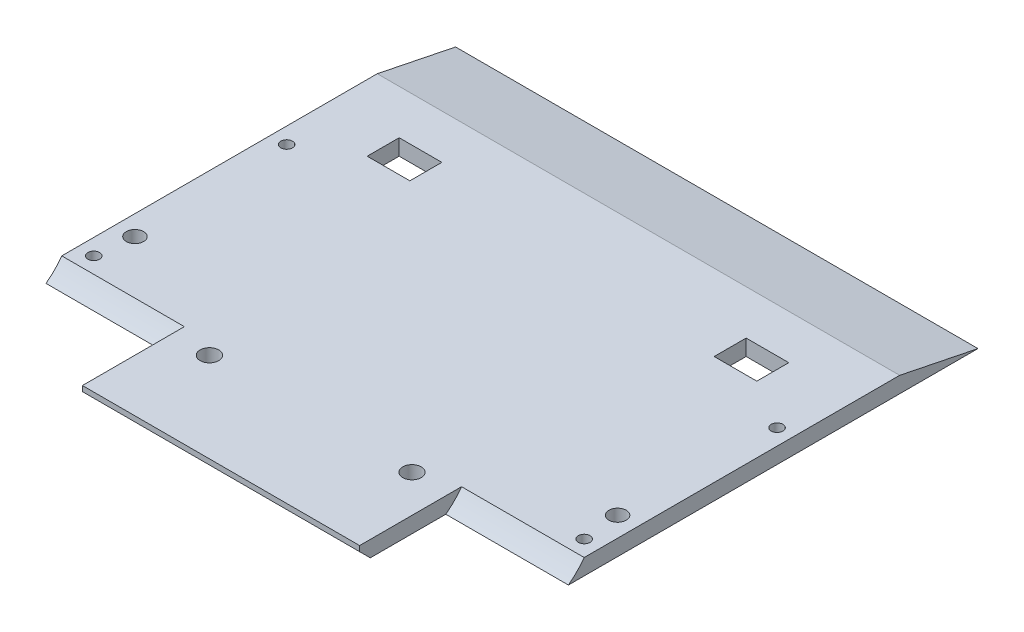
ISO-10303-21;
HEADER;
FILE_DESCRIPTION(('STEP AP214'),'2;1');
FILE_NAME('part.step','',(''),(''),'','','');
FILE_SCHEMA(('AUTOMOTIVE_DESIGN { 1 0 10303 214 1 1 1 1 }'));
ENDSEC;
DATA;
#1=APPLICATION_CONTEXT('core data for automotive mechanical design processes');
#2=APPLICATION_PROTOCOL_DEFINITION('international standard','automotive_design',2000,#1);
#3=PRODUCT_CONTEXT('',#1,'mechanical');
#4=PRODUCT('Part','Part','',(#3));
#5=PRODUCT_RELATED_PRODUCT_CATEGORY('part','',(#4));
#6=PRODUCT_DEFINITION_FORMATION('','',#4);
#7=PRODUCT_DEFINITION_CONTEXT('part definition',#1,'design');
#8=PRODUCT_DEFINITION('design','',#6,#7);
#9=PRODUCT_DEFINITION_SHAPE('','',#8);
#10=(LENGTH_UNIT() NAMED_UNIT(*) SI_UNIT(.MILLI.,.METRE.));
#11=(NAMED_UNIT(*) PLANE_ANGLE_UNIT() SI_UNIT($,.RADIAN.));
#12=(NAMED_UNIT(*) SI_UNIT($,.STERADIAN.) SOLID_ANGLE_UNIT());
#13=UNCERTAINTY_MEASURE_WITH_UNIT(LENGTH_MEASURE(1.E-05),#10,'distance_accuracy_value','');
#14=(GEOMETRIC_REPRESENTATION_CONTEXT(3) GLOBAL_UNCERTAINTY_ASSIGNED_CONTEXT((#13)) GLOBAL_UNIT_ASSIGNED_CONTEXT((#10,
#11,#12)) REPRESENTATION_CONTEXT('',''));
#15=CARTESIAN_POINT('',(0.,0.,0.));
#16=DIRECTION('',(0.,0.,1.));
#17=DIRECTION('',(1.,0.,0.));
#18=AXIS2_PLACEMENT_3D('',#15,#16,#17);
#19=CARTESIAN_POINT('',(28.1112716763006,3.,0.));
#20=DIRECTION('',(-1.,0.,0.));
#21=DIRECTION('',(0.,0.,1.));
#22=AXIS2_PLACEMENT_3D('',#19,#20,#21);
#23=PLANE('',#22);
#24=DIRECTION('',(0.,-1.,0.));
#25=VECTOR('',#24,1.);
#26=CARTESIAN_POINT('',(28.1112716763006,3.,54.9046242774567));
#27=LINE('',#26,#25);
#28=CARTESIAN_POINT('',(28.1112716763006,3.,54.9046242774567));
#29=VERTEX_POINT('',#28);
#30=CARTESIAN_POINT('',(28.1112716763006,2.00000000000003,54.9046242774567));
#31=VERTEX_POINT('',#30);
#32=EDGE_CURVE('E302',#29,#31,#27,.T.);
#33=ORIENTED_EDGE('',*,*,#32,.T.);
#34=DIRECTION('',(0.,-0.707106781186552,-0.707106781186543));
#35=VECTOR('',#34,1.);
#36=CARTESIAN_POINT('',(28.1112716763006,0.,52.9046242774566));
#37=LINE('',#36,#35);
#38=CARTESIAN_POINT('',(28.1112716763006,0.,52.9046242774566));
#39=VERTEX_POINT('',#38);
#40=EDGE_CURVE('E312',#31,#39,#37,.T.);
#41=ORIENTED_EDGE('',*,*,#40,.T.);
#42=DIRECTION('',(0.,0.,-1.));
#43=VECTOR('',#42,1.);
#44=CARTESIAN_POINT('',(28.1112716763006,0.,0.));
#45=LINE('',#44,#43);
#46=CARTESIAN_POINT('',(28.1112716763006,0.,38.7382297241669));
#47=VERTEX_POINT('',#46);
#48=EDGE_CURVE('E275',#39,#47,#45,.T.);
#49=ORIENTED_EDGE('',*,*,#48,.T.);
#50=CARTESIAN_POINT('',(28.1112716763006,11.,46.9046242774566));
#51=DIRECTION('',(-1.,0.,0.));
#52=DIRECTION('',(0.,0.,1.));
#53=AXIS2_PLACEMENT_3D('',#50,#51,#52);
#54=CIRCLE('',#53,13.7);
#55=CARTESIAN_POINT('',(28.1112716763006,3.,35.783023673227));
#56=VERTEX_POINT('',#55);
#57=EDGE_CURVE('E265',#56,#47,#54,.T.);
#58=ORIENTED_EDGE('',*,*,#57,.F.);
#59=DIRECTION('',(0.,0.,-1.));
#60=VECTOR('',#59,1.);
#61=CARTESIAN_POINT('',(28.1112716763006,3.,0.));
#62=LINE('',#61,#60);
#63=EDGE_CURVE('E279',#29,#56,#62,.T.);
#64=ORIENTED_EDGE('',*,*,#63,.F.);
#65=EDGE_LOOP('',(#33,#41,#49,#58,#64));
#66=FACE_BOUND('',#65,.T.);
#67=ADVANCED_FACE('F45',(#66),#23,.F.);
#68=CARTESIAN_POINT('',(-23.8887283236994,3.,0.));
#69=DIRECTION('',(-1.,0.,0.));
#70=DIRECTION('',(0.,0.,1.));
#71=AXIS2_PLACEMENT_3D('',#68,#69,#70);
#72=PLANE('',#71);
#73=DIRECTION('',(0.,0.,-1.));
#74=VECTOR('',#73,1.);
#75=CARTESIAN_POINT('',(-23.8887283236994,0.,0.));
#76=LINE('',#75,#74);
#77=CARTESIAN_POINT('',(-23.8887283236994,0.,52.9046242774567));
#78=VERTEX_POINT('',#77);
#79=CARTESIAN_POINT('',(-23.8887283236994,0.,38.7382297241669));
#80=VERTEX_POINT('',#79);
#81=EDGE_CURVE('E280',#78,#80,#76,.T.);
#82=ORIENTED_EDGE('',*,*,#81,.F.);
#83=DIRECTION('',(0.,0.707106781186552,0.707106781186543));
#84=VECTOR('',#83,1.);
#85=CARTESIAN_POINT('',(-23.8887283236994,-24.9523121387283,27.9523121387287));
#86=LINE('',#85,#84);
#87=CARTESIAN_POINT('',(-23.8887283236994,2.00000000000003,54.9046242774567));
#88=VERTEX_POINT('',#87);
#89=EDGE_CURVE('E308',#78,#88,#86,.T.);
#90=ORIENTED_EDGE('',*,*,#89,.T.);
#91=DIRECTION('',(0.,-1.,0.));
#92=VECTOR('',#91,1.);
#93=CARTESIAN_POINT('',(-23.8887283236994,3.,54.9046242774567));
#94=LINE('',#93,#92);
#95=CARTESIAN_POINT('',(-23.8887283236994,3.,54.9046242774567));
#96=VERTEX_POINT('',#95);
#97=EDGE_CURVE('E290',#96,#88,#94,.T.);
#98=ORIENTED_EDGE('',*,*,#97,.F.);
#99=DIRECTION('',(0.,0.,-1.));
#100=VECTOR('',#99,1.);
#101=CARTESIAN_POINT('',(-23.8887283236994,3.,0.));
#102=LINE('',#101,#100);
#103=CARTESIAN_POINT('',(-23.8887283236994,3.,35.7830236732271));
#104=VERTEX_POINT('',#103);
#105=EDGE_CURVE('E288',#96,#104,#102,.T.);
#106=ORIENTED_EDGE('',*,*,#105,.T.);
#107=CARTESIAN_POINT('',(-23.8887283236994,11.,46.9046242774566));
#108=DIRECTION('',(-1.,0.,0.));
#109=DIRECTION('',(0.,0.,1.));
#110=AXIS2_PLACEMENT_3D('',#107,#108,#109);
#111=CIRCLE('',#110,13.7);
#112=EDGE_CURVE('E262',#104,#80,#111,.T.);
#113=ORIENTED_EDGE('',*,*,#112,.T.);
#114=EDGE_LOOP('',(#82,#90,#98,#106,#113));
#115=FACE_BOUND('',#114,.T.);
#116=ADVANCED_FACE('F368',(#115),#72,.T.);
#117=CARTESIAN_POINT('',(0.,3.,54.9046242774567));
#118=DIRECTION('',(0.,0.,1.));
#119=DIRECTION('',(1.,0.,0.));
#120=AXIS2_PLACEMENT_3D('',#117,#118,#119);
#121=PLANE('',#120);
#122=ORIENTED_EDGE('',*,*,#97,.T.);
#123=DIRECTION('',(1.,0.,0.));
#124=VECTOR('',#123,1.);
#125=CARTESIAN_POINT('',(28.1112716763006,2.00000000000003,54.9046242774566));
#126=LINE('',#125,#124);
#127=EDGE_CURVE('E310',#88,#31,#126,.T.);
#128=ORIENTED_EDGE('',*,*,#127,.T.);
#129=ORIENTED_EDGE('',*,*,#32,.F.);
#130=DIRECTION('',(-1.,0.,0.));
#131=VECTOR('',#130,1.);
#132=CARTESIAN_POINT('',(0.,3.,54.9046242774567));
#133=LINE('',#132,#131);
#134=EDGE_CURVE('E276',#29,#96,#133,.T.);
#135=ORIENTED_EDGE('',*,*,#134,.T.);
#136=EDGE_LOOP('',(#122,#128,#129,#135));
#137=FACE_BOUND('',#136,.T.);
#138=ADVANCED_FACE('F374',(#137),#121,.T.);
#139=CARTESIAN_POINT('',(51.1112716763006,3.,0.));
#140=DIRECTION('',(1.,0.,0.));
#141=DIRECTION('',(0.,0.,-1.));
#142=AXIS2_PLACEMENT_3D('',#139,#140,#141);
#143=PLANE('',#142);
#144=DIRECTION('',(0.,0.,1.));
#145=VECTOR('',#144,1.);
#146=CARTESIAN_POINT('',(51.1112716763006,3.,0.));
#147=LINE('',#146,#145);
#148=CARTESIAN_POINT('',(51.1112716763006,3.,-23.3984372658443));
#149=VERTEX_POINT('',#148);
#150=CARTESIAN_POINT('',(51.1112716763006,3.,35.783023673227));
#151=VERTEX_POINT('',#150);
#152=EDGE_CURVE('E282',#149,#151,#147,.T.);
#153=ORIENTED_EDGE('',*,*,#152,.T.);
#154=CARTESIAN_POINT('',(51.1112716763006,11.,46.9046242774566));
#155=DIRECTION('',(-1.,0.,0.));
#156=DIRECTION('',(0.,0.,1.));
#157=AXIS2_PLACEMENT_3D('',#154,#155,#156);
#158=CIRCLE('',#157,13.7);
#159=CARTESIAN_POINT('',(51.1112716763006,0.,38.7382297241669));
#160=VERTEX_POINT('',#159);
#161=EDGE_CURVE('E253',#151,#160,#158,.T.);
#162=ORIENTED_EDGE('',*,*,#161,.T.);
#163=DIRECTION('',(0.,0.,1.));
#164=VECTOR('',#163,1.);
#165=CARTESIAN_POINT('',(51.1112716763006,0.,0.));
#166=LINE('',#165,#164);
#167=CARTESIAN_POINT('',(51.1112716763006,0.,-38.0953757225434));
#168=VERTEX_POINT('',#167);
#169=EDGE_CURVE('E292',#168,#160,#166,.T.);
#170=ORIENTED_EDGE('',*,*,#169,.F.);
#171=DIRECTION('',(0.,-0.2,-0.979795897113271));
#172=VECTOR('',#171,1.);
#173=CARTESIAN_POINT('',(51.1112716763006,7.5851385663873,-0.935937490633778));
#174=LINE('',#173,#172);
#175=EDGE_CURVE('E273',#149,#168,#174,.T.);
#176=ORIENTED_EDGE('',*,*,#175,.F.);
#177=EDGE_LOOP('',(#153,#162,#170,#176));
#178=FACE_BOUND('',#177,.T.);
#179=ADVANCED_FACE('F378',(#178),#143,.T.);
#180=CARTESIAN_POINT('',(-46.8887283236994,3.,0.));
#181=DIRECTION('',(1.,0.,0.));
#182=DIRECTION('',(0.,0.,-1.));
#183=AXIS2_PLACEMENT_3D('',#180,#181,#182);
#184=PLANE('',#183);
#185=CARTESIAN_POINT('',(-46.8887283236994,11.,46.9046242774566));
#186=DIRECTION('',(-1.,0.,0.));
#187=DIRECTION('',(0.,0.,1.));
#188=AXIS2_PLACEMENT_3D('',#185,#186,#187);
#189=CIRCLE('',#188,13.7);
#190=CARTESIAN_POINT('',(-46.8887283236994,3.,35.7830236732271));
#191=VERTEX_POINT('',#190);
#192=CARTESIAN_POINT('',(-46.8887283236994,0.,38.7382297241669));
#193=VERTEX_POINT('',#192);
#194=EDGE_CURVE('E252',#191,#193,#189,.T.);
#195=ORIENTED_EDGE('',*,*,#194,.F.);
#196=DIRECTION('',(0.,0.,1.));
#197=VECTOR('',#196,1.);
#198=CARTESIAN_POINT('',(-46.8887283236994,3.,0.));
#199=LINE('',#198,#197);
#200=CARTESIAN_POINT('',(-46.8887283236994,3.,-23.3984372658443));
#201=VERTEX_POINT('',#200);
#202=EDGE_CURVE('E285',#201,#191,#199,.T.);
#203=ORIENTED_EDGE('',*,*,#202,.F.);
#204=DIRECTION('',(0.,0.2,0.979795897113271));
#205=VECTOR('',#204,1.);
#206=CARTESIAN_POINT('',(-46.8887283236994,7.4651385663873,-1.52381502890173));
#207=LINE('',#206,#205);
#208=CARTESIAN_POINT('',(-46.8887283236994,0.,-38.0953757225434));
#209=VERTEX_POINT('',#208);
#210=EDGE_CURVE('E268',#209,#201,#207,.T.);
#211=ORIENTED_EDGE('',*,*,#210,.F.);
#212=DIRECTION('',(0.,0.,1.));
#213=VECTOR('',#212,1.);
#214=CARTESIAN_POINT('',(-46.8887283236994,0.,0.));
#215=LINE('',#214,#213);
#216=EDGE_CURVE('E297',#209,#193,#215,.T.);
#217=ORIENTED_EDGE('',*,*,#216,.T.);
#218=EDGE_LOOP('',(#195,#203,#211,#217));
#219=FACE_BOUND('',#218,.T.);
#220=ADVANCED_FACE('F385',(#219),#184,.F.);
#221=CARTESIAN_POINT('',(0.,3.,0.));
#222=DIRECTION('',(0.,1.,0.));
#223=DIRECTION('',(0.,0.,1.));
#224=AXIS2_PLACEMENT_3D('',#221,#222,#223);
#225=PLANE('',#224);
#226=DIRECTION('',(0.,0.,1.));
#227=VECTOR('',#226,1.);
#228=CARTESIAN_POINT('',(-34.4322346511358,3.,-15.0573010504283));
#229=LINE('',#228,#227);
#230=CARTESIAN_POINT('',(-34.4322346511358,3.,-15.0573010504283));
#231=VERTEX_POINT('',#230);
#232=CARTESIAN_POINT('',(-34.4322346511358,3.,-9.05730105042829));
#233=VERTEX_POINT('',#232);
#234=EDGE_CURVE('E61',#231,#233,#229,.T.);
#235=ORIENTED_EDGE('',*,*,#234,.F.);
#236=DIRECTION('',(-1.,0.,0.));
#237=VECTOR('',#236,1.);
#238=CARTESIAN_POINT('',(-34.4322346511358,3.,-15.0573010504283));
#239=LINE('',#238,#237);
#240=CARTESIAN_POINT('',(-26.4322346511358,3.,-15.0573010504283));
#241=VERTEX_POINT('',#240);
#242=EDGE_CURVE('E189',#241,#231,#239,.T.);
#243=ORIENTED_EDGE('',*,*,#242,.F.);
#244=DIRECTION('',(0.,0.,-1.));
#245=VECTOR('',#244,1.);
#246=CARTESIAN_POINT('',(-26.4322346511358,3.,-15.0573010504283));
#247=LINE('',#246,#245);
#248=CARTESIAN_POINT('',(-26.4322346511358,3.,-9.05730105042829));
#249=VERTEX_POINT('',#248);
#250=EDGE_CURVE('E172',#249,#241,#247,.T.);
#251=ORIENTED_EDGE('',*,*,#250,.F.);
#252=DIRECTION('',(1.,0.,0.));
#253=VECTOR('',#252,1.);
#254=CARTESIAN_POINT('',(-34.4322346511358,3.,-9.05730105042829));
#255=LINE('',#254,#253);
#256=EDGE_CURVE('E182',#233,#249,#255,.T.);
#257=ORIENTED_EDGE('',*,*,#256,.F.);
#258=EDGE_LOOP('',(#235,#243,#251,#257));
#259=FACE_BOUND('',#258,.T.);
#260=DIRECTION('',(0.,0.,1.));
#261=VECTOR('',#260,1.);
#262=CARTESIAN_POINT('',(30.6547780037371,3.,-15.0573010504283));
#263=LINE('',#262,#261);
#264=CARTESIAN_POINT('',(30.6547780037371,3.,-15.0573010504283));
#265=VERTEX_POINT('',#264);
#266=CARTESIAN_POINT('',(30.6547780037371,3.,-9.0573010504283));
#267=VERTEX_POINT('',#266);
#268=EDGE_CURVE('E69',#265,#267,#263,.T.);
#269=ORIENTED_EDGE('',*,*,#268,.F.);
#270=DIRECTION('',(-1.,0.,0.));
#271=VECTOR('',#270,1.);
#272=CARTESIAN_POINT('',(30.6547780037371,3.,-15.0573010504283));
#273=LINE('',#272,#271);
#274=CARTESIAN_POINT('',(38.6547780037371,3.,-15.0573010504283));
#275=VERTEX_POINT('',#274);
#276=EDGE_CURVE('E201',#275,#265,#273,.T.);
#277=ORIENTED_EDGE('',*,*,#276,.F.);
#278=DIRECTION('',(0.,0.,-1.));
#279=VECTOR('',#278,1.);
#280=CARTESIAN_POINT('',(38.6547780037371,3.,-15.0573010504283));
#281=LINE('',#280,#279);
#282=CARTESIAN_POINT('',(38.6547780037371,3.,-9.0573010504283));
#283=VERTEX_POINT('',#282);
#284=EDGE_CURVE('E210',#283,#275,#281,.T.);
#285=ORIENTED_EDGE('',*,*,#284,.F.);
#286=DIRECTION('',(1.,0.,0.));
#287=VECTOR('',#286,1.);
#288=CARTESIAN_POINT('',(30.6547780037371,3.,-9.0573010504283));
#289=LINE('',#288,#287);
#290=EDGE_CURVE('E213',#267,#283,#289,.T.);
#291=ORIENTED_EDGE('',*,*,#290,.F.);
#292=EDGE_LOOP('',(#269,#277,#285,#291));
#293=FACE_BOUND('',#292,.T.);
#294=CARTESIAN_POINT('',(-43.1587283236994,3.,25.7815627341557));
#295=DIRECTION('',(0.,1.,0.));
#296=DIRECTION('',(0.,0.,1.));
#297=AXIS2_PLACEMENT_3D('',#294,#295,#296);
#298=CIRCLE('',#297,1.6244518759601);
#299=CARTESIAN_POINT('',(-43.1587283236994,3.,27.4060146101158));
#300=VERTEX_POINT('',#299);
#301=EDGE_CURVE('E196',#300,#300,#298,.T.);
#302=ORIENTED_EDGE('',*,*,#301,.F.);
#303=EDGE_LOOP('',(#302));
#304=FACE_BOUND('',#303,.T.);
#305=CARTESIAN_POINT('',(47.3812716763006,3.,25.7815627341557));
#306=DIRECTION('',(0.,1.,0.));
#307=DIRECTION('',(0.,0.,1.));
#308=AXIS2_PLACEMENT_3D('',#305,#306,#307);
#309=CIRCLE('',#308,1.6244518759601);
#310=CARTESIAN_POINT('',(47.3812716763006,3.,27.4060146101158));
#311=VERTEX_POINT('',#310);
#312=EDGE_CURVE('E220',#311,#311,#309,.T.);
#313=ORIENTED_EDGE('',*,*,#312,.F.);
#314=EDGE_LOOP('',(#313));
#315=FACE_BOUND('',#314,.T.);
#316=CARTESIAN_POINT('',(-16.8887283236994,3.,38.0815627341557));
#317=DIRECTION('',(0.,1.,0.));
#318=DIRECTION('',(0.,0.,1.));
#319=AXIS2_PLACEMENT_3D('',#316,#317,#318);
#320=CIRCLE('',#319,1.75);
#321=CARTESIAN_POINT('',(-16.8887283236994,3.,39.8315627341557));
#322=VERTEX_POINT('',#321);
#323=EDGE_CURVE('E224',#322,#322,#320,.T.);
#324=ORIENTED_EDGE('',*,*,#323,.F.);
#325=EDGE_LOOP('',(#324));
#326=FACE_BOUND('',#325,.T.);
#327=CARTESIAN_POINT('',(21.1112716763006,3.,38.0815627341557));
#328=DIRECTION('',(0.,1.,0.));
#329=DIRECTION('',(0.,0.,1.));
#330=AXIS2_PLACEMENT_3D('',#327,#328,#329);
#331=CIRCLE('',#330,1.75);
#332=CARTESIAN_POINT('',(21.1112716763006,3.,39.8315627341557));
#333=VERTEX_POINT('',#332);
#334=EDGE_CURVE('E228',#333,#333,#331,.T.);
#335=ORIENTED_EDGE('',*,*,#334,.F.);
#336=EDGE_LOOP('',(#335));
#337=FACE_BOUND('',#336,.T.);
#338=CARTESIAN_POINT('',(48.1112716763006,3.,-3.39843726584429));
#339=DIRECTION('',(0.,1.,0.));
#340=DIRECTION('',(0.,0.,1.));
#341=AXIS2_PLACEMENT_3D('',#338,#339,#340);
#342=CIRCLE('',#341,1.1);
#343=CARTESIAN_POINT('',(48.1112716763006,3.,-2.29843726584429));
#344=VERTEX_POINT('',#343);
#345=EDGE_CURVE('E238',#344,#344,#342,.T.);
#346=ORIENTED_EDGE('',*,*,#345,.F.);
#347=EDGE_LOOP('',(#346));
#348=FACE_BOUND('',#347,.T.);
#349=CARTESIAN_POINT('',(48.1112716763006,3.,32.783023673227));
#350=DIRECTION('',(0.,1.,0.));
#351=DIRECTION('',(0.,0.,1.));
#352=AXIS2_PLACEMENT_3D('',#349,#350,#351);
#353=CIRCLE('',#352,1.1);
#354=CARTESIAN_POINT('',(48.1112716763006,3.,33.883023673227));
#355=VERTEX_POINT('',#354);
#356=EDGE_CURVE('E235',#355,#355,#353,.T.);
#357=ORIENTED_EDGE('',*,*,#356,.F.);
#358=EDGE_LOOP('',(#357));
#359=FACE_BOUND('',#358,.T.);
#360=CARTESIAN_POINT('',(-43.8887283236994,3.,32.783023673227));
#361=DIRECTION('',(0.,1.,0.));
#362=DIRECTION('',(0.,0.,1.));
#363=AXIS2_PLACEMENT_3D('',#360,#361,#362);
#364=CIRCLE('',#363,1.1);
#365=CARTESIAN_POINT('',(-43.8887283236994,3.,33.883023673227));
#366=VERTEX_POINT('',#365);
#367=EDGE_CURVE('E231',#366,#366,#364,.T.);
#368=ORIENTED_EDGE('',*,*,#367,.F.);
#369=EDGE_LOOP('',(#368));
#370=FACE_BOUND('',#369,.T.);
#371=CARTESIAN_POINT('',(-43.8887283236994,3.,-3.39843726584429));
#372=DIRECTION('',(0.,1.,0.));
#373=DIRECTION('',(0.,0.,1.));
#374=AXIS2_PLACEMENT_3D('',#371,#372,#373);
#375=CIRCLE('',#374,1.1);
#376=CARTESIAN_POINT('',(-43.8887283236994,3.,-2.29843726584429));
#377=VERTEX_POINT('',#376);
#378=EDGE_CURVE('E234',#377,#377,#375,.T.);
#379=ORIENTED_EDGE('',*,*,#378,.F.);
#380=EDGE_LOOP('',(#379));
#381=FACE_BOUND('',#380,.T.);
#382=DIRECTION('',(-1.,0.,0.));
#383=VECTOR('',#382,1.);
#384=CARTESIAN_POINT('',(51.1112716763006,3.,35.783023673227));
#385=LINE('',#384,#383);
#386=EDGE_CURVE('E245',#151,#56,#385,.T.);
#387=ORIENTED_EDGE('',*,*,#386,.F.);
#388=ORIENTED_EDGE('',*,*,#152,.F.);
#389=DIRECTION('',(-1.,0.,0.));
#390=VECTOR('',#389,1.);
#391=CARTESIAN_POINT('',(55.1112716763006,3.,-23.3984372658443));
#392=LINE('',#391,#390);
#393=EDGE_CURVE('E270',#149,#201,#392,.T.);
#394=ORIENTED_EDGE('',*,*,#393,.T.);
#395=ORIENTED_EDGE('',*,*,#202,.T.);
#396=DIRECTION('',(-1.,0.,0.));
#397=VECTOR('',#396,1.);
#398=CARTESIAN_POINT('',(-23.8887283236994,3.,35.7830236732271));
#399=LINE('',#398,#397);
#400=EDGE_CURVE('E248',#104,#191,#399,.T.);
#401=ORIENTED_EDGE('',*,*,#400,.F.);
#402=ORIENTED_EDGE('',*,*,#105,.F.);
#403=ORIENTED_EDGE('',*,*,#134,.F.);
#404=ORIENTED_EDGE('',*,*,#63,.T.);
#405=EDGE_LOOP('',(#387,#388,#394,#395,#401,#402,#403,#404));
#406=FACE_BOUND('',#405,.T.);
#407=ADVANCED_FACE('F186',(#259,#293,#304,#315,#326,#337,#348,#359,#370,#381,#406),#225,.T.);
#408=CARTESIAN_POINT('',(0.,0.,0.));
#409=DIRECTION('',(0.,1.,0.));
#410=DIRECTION('',(0.,0.,1.));
#411=AXIS2_PLACEMENT_3D('',#408,#409,#410);
#412=PLANE('',#411);
#413=DIRECTION('',(-1.,0.,0.));
#414=VECTOR('',#413,1.);
#415=CARTESIAN_POINT('',(0.,0.,-15.0573010504283));
#416=LINE('',#415,#414);
#417=CARTESIAN_POINT('',(-26.4322346511358,0.,-15.0573010504283));
#418=VERTEX_POINT('',#417);
#419=CARTESIAN_POINT('',(-34.4322346511358,0.,-15.0573010504283));
#420=VERTEX_POINT('',#419);
#421=EDGE_CURVE('E54',#418,#420,#416,.T.);
#422=ORIENTED_EDGE('',*,*,#421,.T.);
#423=DIRECTION('',(0.,0.,1.));
#424=VECTOR('',#423,1.);
#425=CARTESIAN_POINT('',(-34.4322346511358,0.,0.));
#426=LINE('',#425,#424);
#427=CARTESIAN_POINT('',(-34.4322346511358,0.,-9.05730105042829));
#428=VERTEX_POINT('',#427);
#429=EDGE_CURVE('E11',#420,#428,#426,.T.);
#430=ORIENTED_EDGE('',*,*,#429,.T.);
#431=DIRECTION('',(1.,0.,0.));
#432=VECTOR('',#431,1.);
#433=CARTESIAN_POINT('',(0.,0.,-9.05730105042829));
#434=LINE('',#433,#432);
#435=CARTESIAN_POINT('',(-26.4322346511358,0.,-9.05730105042829));
#436=VERTEX_POINT('',#435);
#437=EDGE_CURVE('E344',#428,#436,#434,.T.);
#438=ORIENTED_EDGE('',*,*,#437,.T.);
#439=DIRECTION('',(0.,0.,-1.));
#440=VECTOR('',#439,1.);
#441=CARTESIAN_POINT('',(-26.4322346511358,0.,0.));
#442=LINE('',#441,#440);
#443=EDGE_CURVE('E175',#436,#418,#442,.T.);
#444=ORIENTED_EDGE('',*,*,#443,.T.);
#445=EDGE_LOOP('',(#422,#430,#438,#444));
#446=FACE_BOUND('',#445,.T.);
#447=DIRECTION('',(-1.,0.,0.));
#448=VECTOR('',#447,1.);
#449=CARTESIAN_POINT('',(0.,0.,-15.0573010504283));
#450=LINE('',#449,#448);
#451=CARTESIAN_POINT('',(38.6547780037371,0.,-15.0573010504283));
#452=VERTEX_POINT('',#451);
#453=CARTESIAN_POINT('',(30.6547780037371,0.,-15.0573010504283));
#454=VERTEX_POINT('',#453);
#455=EDGE_CURVE('E338',#452,#454,#450,.T.);
#456=ORIENTED_EDGE('',*,*,#455,.T.);
#457=DIRECTION('',(0.,0.,1.));
#458=VECTOR('',#457,1.);
#459=CARTESIAN_POINT('',(30.6547780037371,0.,0.));
#460=LINE('',#459,#458);
#461=CARTESIAN_POINT('',(30.6547780037371,0.,-9.0573010504283));
#462=VERTEX_POINT('',#461);
#463=EDGE_CURVE('E341',#454,#462,#460,.T.);
#464=ORIENTED_EDGE('',*,*,#463,.T.);
#465=DIRECTION('',(1.,0.,0.));
#466=VECTOR('',#465,1.);
#467=CARTESIAN_POINT('',(0.,0.,-9.0573010504283));
#468=LINE('',#467,#466);
#469=CARTESIAN_POINT('',(38.6547780037371,0.,-9.0573010504283));
#470=VERTEX_POINT('',#469);
#471=EDGE_CURVE('E314',#462,#470,#468,.T.);
#472=ORIENTED_EDGE('',*,*,#471,.T.);
#473=DIRECTION('',(0.,0.,-1.));
#474=VECTOR('',#473,1.);
#475=CARTESIAN_POINT('',(38.6547780037371,0.,0.));
#476=LINE('',#475,#474);
#477=EDGE_CURVE('E335',#470,#452,#476,.T.);
#478=ORIENTED_EDGE('',*,*,#477,.T.);
#479=EDGE_LOOP('',(#456,#464,#472,#478));
#480=FACE_BOUND('',#479,.T.);
#481=CARTESIAN_POINT('',(-43.1587283236994,0.,25.7815627341557));
#482=DIRECTION('',(0.,1.,0.));
#483=DIRECTION('',(0.,0.,1.));
#484=AXIS2_PLACEMENT_3D('',#481,#482,#483);
#485=CIRCLE('',#484,1.6244518759601);
#486=CARTESIAN_POINT('',(-43.1587283236994,0.,27.4060146101158));
#487=VERTEX_POINT('',#486);
#488=EDGE_CURVE('E219',#487,#487,#485,.T.);
#489=ORIENTED_EDGE('',*,*,#488,.T.);
#490=EDGE_LOOP('',(#489));
#491=FACE_BOUND('',#490,.T.);
#492=CARTESIAN_POINT('',(47.3812716763006,0.,25.7815627341557));
#493=DIRECTION('',(0.,1.,0.));
#494=DIRECTION('',(0.,0.,1.));
#495=AXIS2_PLACEMENT_3D('',#492,#493,#494);
#496=CIRCLE('',#495,1.6244518759601);
#497=CARTESIAN_POINT('',(47.3812716763006,0.,27.4060146101158));
#498=VERTEX_POINT('',#497);
#499=EDGE_CURVE('E223',#498,#498,#496,.T.);
#500=ORIENTED_EDGE('',*,*,#499,.T.);
#501=EDGE_LOOP('',(#500));
#502=FACE_BOUND('',#501,.T.);
#503=CARTESIAN_POINT('',(-16.8887283236994,0.,38.0815627341557));
#504=DIRECTION('',(0.,1.,0.));
#505=DIRECTION('',(0.,0.,1.));
#506=AXIS2_PLACEMENT_3D('',#503,#504,#505);
#507=CIRCLE('',#506,1.75);
#508=CARTESIAN_POINT('',(-16.8887283236994,0.,39.8315627341557));
#509=VERTEX_POINT('',#508);
#510=EDGE_CURVE('E241',#509,#509,#507,.T.);
#511=ORIENTED_EDGE('',*,*,#510,.T.);
#512=EDGE_LOOP('',(#511));
#513=FACE_BOUND('',#512,.T.);
#514=CARTESIAN_POINT('',(21.1112716763006,0.,38.0815627341557));
#515=DIRECTION('',(0.,1.,0.));
#516=DIRECTION('',(0.,0.,1.));
#517=AXIS2_PLACEMENT_3D('',#514,#515,#516);
#518=CIRCLE('',#517,1.75);
#519=CARTESIAN_POINT('',(21.1112716763006,0.,39.8315627341557));
#520=VERTEX_POINT('',#519);
#521=EDGE_CURVE('E227',#520,#520,#518,.T.);
#522=ORIENTED_EDGE('',*,*,#521,.T.);
#523=EDGE_LOOP('',(#522));
#524=FACE_BOUND('',#523,.T.);
#525=CARTESIAN_POINT('',(48.1112716763006,0.,-3.39843726584429));
#526=DIRECTION('',(0.,1.,0.));
#527=DIRECTION('',(0.,0.,1.));
#528=AXIS2_PLACEMENT_3D('',#525,#526,#527);
#529=CIRCLE('',#528,1.1);
#530=CARTESIAN_POINT('',(48.1112716763006,0.,-2.29843726584429));
#531=VERTEX_POINT('',#530);
#532=EDGE_CURVE('E249',#531,#531,#529,.T.);
#533=ORIENTED_EDGE('',*,*,#532,.T.);
#534=EDGE_LOOP('',(#533));
#535=FACE_BOUND('',#534,.T.);
#536=CARTESIAN_POINT('',(48.1112716763006,0.,32.783023673227));
#537=DIRECTION('',(0.,1.,0.));
#538=DIRECTION('',(0.,0.,1.));
#539=AXIS2_PLACEMENT_3D('',#536,#537,#538);
#540=CIRCLE('',#539,1.1);
#541=CARTESIAN_POINT('',(48.1112716763006,0.,33.883023673227));
#542=VERTEX_POINT('',#541);
#543=EDGE_CURVE('E320',#542,#542,#540,.T.);
#544=ORIENTED_EDGE('',*,*,#543,.T.);
#545=EDGE_LOOP('',(#544));
#546=FACE_BOUND('',#545,.T.);
#547=CARTESIAN_POINT('',(-43.8887283236994,0.,32.783023673227));
#548=DIRECTION('',(0.,1.,0.));
#549=DIRECTION('',(0.,0.,1.));
#550=AXIS2_PLACEMENT_3D('',#547,#548,#549);
#551=CIRCLE('',#550,1.1);
#552=CARTESIAN_POINT('',(-43.8887283236994,0.,33.883023673227));
#553=VERTEX_POINT('',#552);
#554=EDGE_CURVE('E317',#553,#553,#551,.T.);
#555=ORIENTED_EDGE('',*,*,#554,.T.);
#556=EDGE_LOOP('',(#555));
#557=FACE_BOUND('',#556,.T.);
#558=CARTESIAN_POINT('',(-43.8887283236994,0.,-3.39843726584429));
#559=DIRECTION('',(0.,1.,0.));
#560=DIRECTION('',(0.,0.,1.));
#561=AXIS2_PLACEMENT_3D('',#558,#559,#560);
#562=CIRCLE('',#561,1.1);
#563=CARTESIAN_POINT('',(-43.8887283236994,0.,-2.29843726584429));
#564=VERTEX_POINT('',#563);
#565=EDGE_CURVE('E244',#564,#564,#562,.T.);
#566=ORIENTED_EDGE('',*,*,#565,.T.);
#567=EDGE_LOOP('',(#566));
#568=FACE_BOUND('',#567,.T.);
#569=ORIENTED_EDGE('',*,*,#48,.F.);
#570=DIRECTION('',(-1.,0.,0.));
#571=VECTOR('',#570,1.);
#572=CARTESIAN_POINT('',(-23.8887283236994,0.,52.9046242774567));
#573=LINE('',#572,#571);
#574=EDGE_CURVE('E305',#39,#78,#573,.T.);
#575=ORIENTED_EDGE('',*,*,#574,.T.);
#576=ORIENTED_EDGE('',*,*,#81,.T.);
#577=DIRECTION('',(-1.,0.,0.));
#578=VECTOR('',#577,1.);
#579=CARTESIAN_POINT('',(51.1112716763006,0.,38.7382297241669));
#580=LINE('',#579,#578);
#581=EDGE_CURVE('E256',#80,#193,#580,.T.);
#582=ORIENTED_EDGE('',*,*,#581,.T.);
#583=ORIENTED_EDGE('',*,*,#216,.F.);
#584=DIRECTION('',(1.,0.,0.));
#585=VECTOR('',#584,1.);
#586=CARTESIAN_POINT('',(0.,0.,-38.0953757225434));
#587=LINE('',#586,#585);
#588=EDGE_CURVE('E294',#209,#168,#587,.T.);
#589=ORIENTED_EDGE('',*,*,#588,.T.);
#590=ORIENTED_EDGE('',*,*,#169,.T.);
#591=EDGE_CURVE('E259',#160,#47,#580,.T.);
#592=ORIENTED_EDGE('',*,*,#591,.T.);
#593=EDGE_LOOP('',(#569,#575,#576,#582,#583,#589,#590,#592));
#594=FACE_BOUND('',#593,.T.);
#595=ADVANCED_FACE('F348',(#446,#480,#491,#502,#513,#524,#535,#546,#557,#568,#594),#412,.F.);
#596=CARTESIAN_POINT('',(55.1112716763006,7.4651385663873,-1.52381502890174));
#597=DIRECTION('',(0.,-0.979795897113271,0.2));
#598=DIRECTION('',(0.,-0.2,-0.979795897113271));
#599=AXIS2_PLACEMENT_3D('',#596,#597,#598);
#600=PLANE('',#599);
#601=ORIENTED_EDGE('',*,*,#175,.T.);
#602=ORIENTED_EDGE('',*,*,#588,.F.);
#603=ORIENTED_EDGE('',*,*,#210,.T.);
#604=ORIENTED_EDGE('',*,*,#393,.F.);
#605=EDGE_LOOP('',(#601,#602,#603,#604));
#606=FACE_BOUND('',#605,.T.);
#607=ADVANCED_FACE('F415',(#606),#600,.F.);
#608=CARTESIAN_POINT('',(51.1112716763006,11.,46.9046242774566));
#609=DIRECTION('',(-1.,0.,0.));
#610=DIRECTION('',(0.,0.,1.));
#611=AXIS2_PLACEMENT_3D('',#608,#609,#610);
#612=CYLINDRICAL_SURFACE('',#611,13.7);
#613=ORIENTED_EDGE('',*,*,#161,.F.);
#614=ORIENTED_EDGE('',*,*,#386,.T.);
#615=ORIENTED_EDGE('',*,*,#57,.T.);
#616=ORIENTED_EDGE('',*,*,#591,.F.);
#617=EDGE_LOOP('',(#613,#614,#615,#616));
#618=FACE_BOUND('',#617,.T.);
#619=ADVANCED_FACE('F401',(#618),#612,.F.);
#620=ORIENTED_EDGE('',*,*,#112,.F.);
#621=ORIENTED_EDGE('',*,*,#400,.T.);
#622=ORIENTED_EDGE('',*,*,#194,.T.);
#623=ORIENTED_EDGE('',*,*,#581,.F.);
#624=EDGE_LOOP('',(#620,#621,#622,#623));
#625=FACE_BOUND('',#624,.T.);
#626=ADVANCED_FACE('F408',(#625),#612,.F.);
#627=CARTESIAN_POINT('',(0.,0.,52.9046242774567));
#628=DIRECTION('',(0.,-0.707106781186542,0.707106781186552));
#629=DIRECTION('',(1.,0.,0.));
#630=AXIS2_PLACEMENT_3D('',#627,#628,#629);
#631=PLANE('',#630);
#632=ORIENTED_EDGE('',*,*,#40,.F.);
#633=ORIENTED_EDGE('',*,*,#127,.F.);
#634=ORIENTED_EDGE('',*,*,#89,.F.);
#635=ORIENTED_EDGE('',*,*,#574,.F.);
#636=EDGE_LOOP('',(#632,#633,#634,#635));
#637=FACE_BOUND('',#636,.T.);
#638=ADVANCED_FACE('F48',(#637),#631,.T.);
#639=CARTESIAN_POINT('',(-43.8887283236994,-20.,-3.39843726584429));
#640=DIRECTION('',(0.,1.,0.));
#641=DIRECTION('',(0.,0.,1.));
#642=AXIS2_PLACEMENT_3D('',#639,#640,#641);
#643=CYLINDRICAL_SURFACE('',#642,1.1);
#644=ORIENTED_EDGE('',*,*,#378,.T.);
#645=EDGE_LOOP('',(#644));
#646=FACE_BOUND('',#645,.T.);
#647=ORIENTED_EDGE('',*,*,#565,.F.);
#648=EDGE_LOOP('',(#647));
#649=FACE_BOUND('',#648,.T.);
#650=ADVANCED_FACE('F589',(#646,#649),#643,.F.);
#651=CARTESIAN_POINT('',(-43.8887283236994,-20.,32.783023673227));
#652=DIRECTION('',(0.,1.,0.));
#653=DIRECTION('',(0.,0.,1.));
#654=AXIS2_PLACEMENT_3D('',#651,#652,#653);
#655=CYLINDRICAL_SURFACE('',#654,1.1);
#656=ORIENTED_EDGE('',*,*,#367,.T.);
#657=EDGE_LOOP('',(#656));
#658=FACE_BOUND('',#657,.T.);
#659=ORIENTED_EDGE('',*,*,#554,.F.);
#660=EDGE_LOOP('',(#659));
#661=FACE_BOUND('',#660,.T.);
#662=ADVANCED_FACE('F579',(#658,#661),#655,.F.);
#663=CARTESIAN_POINT('',(48.1112716763006,-20.,32.783023673227));
#664=DIRECTION('',(0.,1.,0.));
#665=DIRECTION('',(0.,0.,1.));
#666=AXIS2_PLACEMENT_3D('',#663,#664,#665);
#667=CYLINDRICAL_SURFACE('',#666,1.1);
#668=ORIENTED_EDGE('',*,*,#356,.T.);
#669=EDGE_LOOP('',(#668));
#670=FACE_BOUND('',#669,.T.);
#671=ORIENTED_EDGE('',*,*,#543,.F.);
#672=EDGE_LOOP('',(#671));
#673=FACE_BOUND('',#672,.T.);
#674=ADVANCED_FACE('F569',(#670,#673),#667,.F.);
#675=CARTESIAN_POINT('',(48.1112716763006,-20.,-3.39843726584429));
#676=DIRECTION('',(0.,1.,0.));
#677=DIRECTION('',(0.,0.,1.));
#678=AXIS2_PLACEMENT_3D('',#675,#676,#677);
#679=CYLINDRICAL_SURFACE('',#678,1.1);
#680=ORIENTED_EDGE('',*,*,#345,.T.);
#681=EDGE_LOOP('',(#680));
#682=FACE_BOUND('',#681,.T.);
#683=ORIENTED_EDGE('',*,*,#532,.F.);
#684=EDGE_LOOP('',(#683));
#685=FACE_BOUND('',#684,.T.);
#686=ADVANCED_FACE('F559',(#682,#685),#679,.F.);
#687=CARTESIAN_POINT('',(21.1112716763006,-49.,38.0815627341557));
#688=DIRECTION('',(0.,1.,0.));
#689=DIRECTION('',(0.,0.,1.));
#690=AXIS2_PLACEMENT_3D('',#687,#688,#689);
#691=CYLINDRICAL_SURFACE('',#690,1.75);
#692=ORIENTED_EDGE('',*,*,#334,.T.);
#693=EDGE_LOOP('',(#692));
#694=FACE_BOUND('',#693,.T.);
#695=ORIENTED_EDGE('',*,*,#521,.F.);
#696=EDGE_LOOP('',(#695));
#697=FACE_BOUND('',#696,.T.);
#698=ADVANCED_FACE('F549',(#694,#697),#691,.F.);
#699=CARTESIAN_POINT('',(-16.8887283236994,-49.,38.0815627341557));
#700=DIRECTION('',(0.,1.,0.));
#701=DIRECTION('',(0.,0.,1.));
#702=AXIS2_PLACEMENT_3D('',#699,#700,#701);
#703=CYLINDRICAL_SURFACE('',#702,1.75);
#704=ORIENTED_EDGE('',*,*,#323,.T.);
#705=EDGE_LOOP('',(#704));
#706=FACE_BOUND('',#705,.T.);
#707=ORIENTED_EDGE('',*,*,#510,.F.);
#708=EDGE_LOOP('',(#707));
#709=FACE_BOUND('',#708,.T.);
#710=ADVANCED_FACE('F539',(#706,#709),#703,.F.);
#711=CARTESIAN_POINT('',(47.3812716763006,-0.999999999999965,25.7815627341557));
#712=DIRECTION('',(0.,1.,0.));
#713=DIRECTION('',(0.,0.,1.));
#714=AXIS2_PLACEMENT_3D('',#711,#712,#713);
#715=CYLINDRICAL_SURFACE('',#714,1.6244518759601);
#716=ORIENTED_EDGE('',*,*,#312,.T.);
#717=EDGE_LOOP('',(#716));
#718=FACE_BOUND('',#717,.T.);
#719=ORIENTED_EDGE('',*,*,#499,.F.);
#720=EDGE_LOOP('',(#719));
#721=FACE_BOUND('',#720,.T.);
#722=ADVANCED_FACE('F530',(#718,#721),#715,.F.);
#723=CARTESIAN_POINT('',(-43.1587283236994,-0.999999999999965,25.7815627341557));
#724=DIRECTION('',(0.,1.,0.));
#725=DIRECTION('',(0.,0.,1.));
#726=AXIS2_PLACEMENT_3D('',#723,#724,#725);
#727=CYLINDRICAL_SURFACE('',#726,1.6244518759601);
#728=ORIENTED_EDGE('',*,*,#301,.T.);
#729=EDGE_LOOP('',(#728));
#730=FACE_BOUND('',#729,.T.);
#731=ORIENTED_EDGE('',*,*,#488,.F.);
#732=EDGE_LOOP('',(#731));
#733=FACE_BOUND('',#732,.T.);
#734=ADVANCED_FACE('F457',(#730,#733),#727,.F.);
#735=CARTESIAN_POINT('',(30.6547780037371,-0.999999999999965,-15.0573010504283));
#736=DIRECTION('',(-1.,0.,0.));
#737=DIRECTION('',(0.,0.,1.));
#738=AXIS2_PLACEMENT_3D('',#735,#736,#737);
#739=PLANE('',#738);
#740=DIRECTION('',(0.,1.,0.));
#741=VECTOR('',#740,1.);
#742=CARTESIAN_POINT('',(30.6547780037371,-0.999999999999965,-15.0573010504283));
#743=LINE('',#742,#741);
#744=EDGE_CURVE('E206',#454,#265,#743,.T.);
#745=ORIENTED_EDGE('',*,*,#744,.T.);
#746=ORIENTED_EDGE('',*,*,#268,.T.);
#747=DIRECTION('',(0.,1.,0.));
#748=VECTOR('',#747,1.);
#749=CARTESIAN_POINT('',(30.6547780037371,-0.999999999999965,-9.0573010504283));
#750=LINE('',#749,#748);
#751=EDGE_CURVE('E199',#462,#267,#750,.T.);
#752=ORIENTED_EDGE('',*,*,#751,.F.);
#753=ORIENTED_EDGE('',*,*,#463,.F.);
#754=EDGE_LOOP('',(#745,#746,#752,#753));
#755=FACE_BOUND('',#754,.T.);
#756=ADVANCED_FACE('F451',(#755),#739,.F.);
#757=CARTESIAN_POINT('',(30.6547780037371,-0.999999999999965,-15.0573010504283));
#758=DIRECTION('',(0.,0.,-1.));
#759=DIRECTION('',(-1.,0.,0.));
#760=AXIS2_PLACEMENT_3D('',#757,#758,#759);
#761=PLANE('',#760);
#762=DIRECTION('',(0.,1.,0.));
#763=VECTOR('',#762,1.);
#764=CARTESIAN_POINT('',(38.6547780037371,-0.999999999999965,-15.0573010504283));
#765=LINE('',#764,#763);
#766=EDGE_CURVE('E204',#452,#275,#765,.T.);
#767=ORIENTED_EDGE('',*,*,#766,.T.);
#768=ORIENTED_EDGE('',*,*,#276,.T.);
#769=ORIENTED_EDGE('',*,*,#744,.F.);
#770=ORIENTED_EDGE('',*,*,#455,.F.);
#771=EDGE_LOOP('',(#767,#768,#769,#770));
#772=FACE_BOUND('',#771,.T.);
#773=ADVANCED_FACE('F456',(#772),#761,.F.);
#774=CARTESIAN_POINT('',(38.6547780037371,-0.999999999999965,-15.0573010504283));
#775=DIRECTION('',(1.,0.,0.));
#776=DIRECTION('',(0.,0.,-1.));
#777=AXIS2_PLACEMENT_3D('',#774,#775,#776);
#778=PLANE('',#777);
#779=DIRECTION('',(0.,1.,0.));
#780=VECTOR('',#779,1.);
#781=CARTESIAN_POINT('',(38.6547780037371,-0.999999999999965,-9.0573010504283));
#782=LINE('',#781,#780);
#783=EDGE_CURVE('E202',#470,#283,#782,.T.);
#784=ORIENTED_EDGE('',*,*,#783,.T.);
#785=ORIENTED_EDGE('',*,*,#284,.T.);
#786=ORIENTED_EDGE('',*,*,#766,.F.);
#787=ORIENTED_EDGE('',*,*,#477,.F.);
#788=EDGE_LOOP('',(#784,#785,#786,#787));
#789=FACE_BOUND('',#788,.T.);
#790=ADVANCED_FACE('F362',(#789),#778,.F.);
#791=CARTESIAN_POINT('',(30.6547780037371,-0.999999999999965,-9.0573010504283));
#792=DIRECTION('',(0.,0.,1.));
#793=DIRECTION('',(1.,0.,0.));
#794=AXIS2_PLACEMENT_3D('',#791,#792,#793);
#795=PLANE('',#794);
#796=ORIENTED_EDGE('',*,*,#751,.T.);
#797=ORIENTED_EDGE('',*,*,#290,.T.);
#798=ORIENTED_EDGE('',*,*,#783,.F.);
#799=ORIENTED_EDGE('',*,*,#471,.F.);
#800=EDGE_LOOP('',(#796,#797,#798,#799));
#801=FACE_BOUND('',#800,.T.);
#802=ADVANCED_FACE('F355',(#801),#795,.F.);
#803=CARTESIAN_POINT('',(-34.4322346511358,-0.999999999999965,-15.0573010504283));
#804=DIRECTION('',(-1.,0.,0.));
#805=DIRECTION('',(0.,0.,1.));
#806=AXIS2_PLACEMENT_3D('',#803,#804,#805);
#807=PLANE('',#806);
#808=DIRECTION('',(0.,1.,0.));
#809=VECTOR('',#808,1.);
#810=CARTESIAN_POINT('',(-34.4322346511358,-0.999999999999965,-15.0573010504283));
#811=LINE('',#810,#809);
#812=EDGE_CURVE('E194',#420,#231,#811,.T.);
#813=ORIENTED_EDGE('',*,*,#812,.T.);
#814=ORIENTED_EDGE('',*,*,#234,.T.);
#815=DIRECTION('',(0.,1.,0.));
#816=VECTOR('',#815,1.);
#817=CARTESIAN_POINT('',(-34.4322346511358,-0.999999999999965,-9.05730105042829));
#818=LINE('',#817,#816);
#819=EDGE_CURVE('E179',#428,#233,#818,.T.);
#820=ORIENTED_EDGE('',*,*,#819,.F.);
#821=ORIENTED_EDGE('',*,*,#429,.F.);
#822=EDGE_LOOP('',(#813,#814,#820,#821));
#823=FACE_BOUND('',#822,.T.);
#824=ADVANCED_FACE('F353',(#823),#807,.F.);
#825=CARTESIAN_POINT('',(-34.4322346511358,-0.999999999999965,-15.0573010504283));
#826=DIRECTION('',(0.,0.,-1.));
#827=DIRECTION('',(-1.,0.,0.));
#828=AXIS2_PLACEMENT_3D('',#825,#826,#827);
#829=PLANE('',#828);
#830=DIRECTION('',(0.,1.,0.));
#831=VECTOR('',#830,1.);
#832=CARTESIAN_POINT('',(-26.4322346511358,-0.999999999999965,-15.0573010504283));
#833=LINE('',#832,#831);
#834=EDGE_CURVE('E178',#418,#241,#833,.T.);
#835=ORIENTED_EDGE('',*,*,#834,.T.);
#836=ORIENTED_EDGE('',*,*,#242,.T.);
#837=ORIENTED_EDGE('',*,*,#812,.F.);
#838=ORIENTED_EDGE('',*,*,#421,.F.);
#839=EDGE_LOOP('',(#835,#836,#837,#838));
#840=FACE_BOUND('',#839,.T.);
#841=ADVANCED_FACE('F352',(#840),#829,.F.);
#842=CARTESIAN_POINT('',(-26.4322346511358,-0.999999999999965,-15.0573010504283));
#843=DIRECTION('',(1.,0.,0.));
#844=DIRECTION('',(0.,0.,-1.));
#845=AXIS2_PLACEMENT_3D('',#842,#843,#844);
#846=PLANE('',#845);
#847=DIRECTION('',(0.,1.,0.));
#848=VECTOR('',#847,1.);
#849=CARTESIAN_POINT('',(-26.4322346511358,-0.999999999999965,-9.05730105042829));
#850=LINE('',#849,#848);
#851=EDGE_CURVE('E167',#436,#249,#850,.T.);
#852=ORIENTED_EDGE('',*,*,#851,.T.);
#853=ORIENTED_EDGE('',*,*,#250,.T.);
#854=ORIENTED_EDGE('',*,*,#834,.F.);
#855=ORIENTED_EDGE('',*,*,#443,.F.);
#856=EDGE_LOOP('',(#852,#853,#854,#855));
#857=FACE_BOUND('',#856,.T.);
#858=ADVANCED_FACE('F169',(#857),#846,.F.);
#859=CARTESIAN_POINT('',(-34.4322346511358,-0.999999999999965,-9.05730105042829));
#860=DIRECTION('',(0.,0.,1.));
#861=DIRECTION('',(1.,0.,0.));
#862=AXIS2_PLACEMENT_3D('',#859,#860,#861);
#863=PLANE('',#862);
#864=ORIENTED_EDGE('',*,*,#819,.T.);
#865=ORIENTED_EDGE('',*,*,#256,.T.);
#866=ORIENTED_EDGE('',*,*,#851,.F.);
#867=ORIENTED_EDGE('',*,*,#437,.F.);
#868=EDGE_LOOP('',(#864,#865,#866,#867));
#869=FACE_BOUND('',#868,.T.);
#870=ADVANCED_FACE('F183',(#869),#863,.F.);
#871=CLOSED_SHELL('',(#67,#116,#138,#179,#220,#407,#595,#607,#619,#626,#638,#650,#662,#674,#686,
#698,#710,#722,#734,#756,#773,#790,#802,#824,#841,#858,#870));
#872=MANIFOLD_SOLID_BREP('B2',#871);
#873=ADVANCED_BREP_SHAPE_REPRESENTATION('',(#18,#872),#14);
#874=SHAPE_DEFINITION_REPRESENTATION(#9,#873);
ENDSEC;
END-ISO-10303-21;
